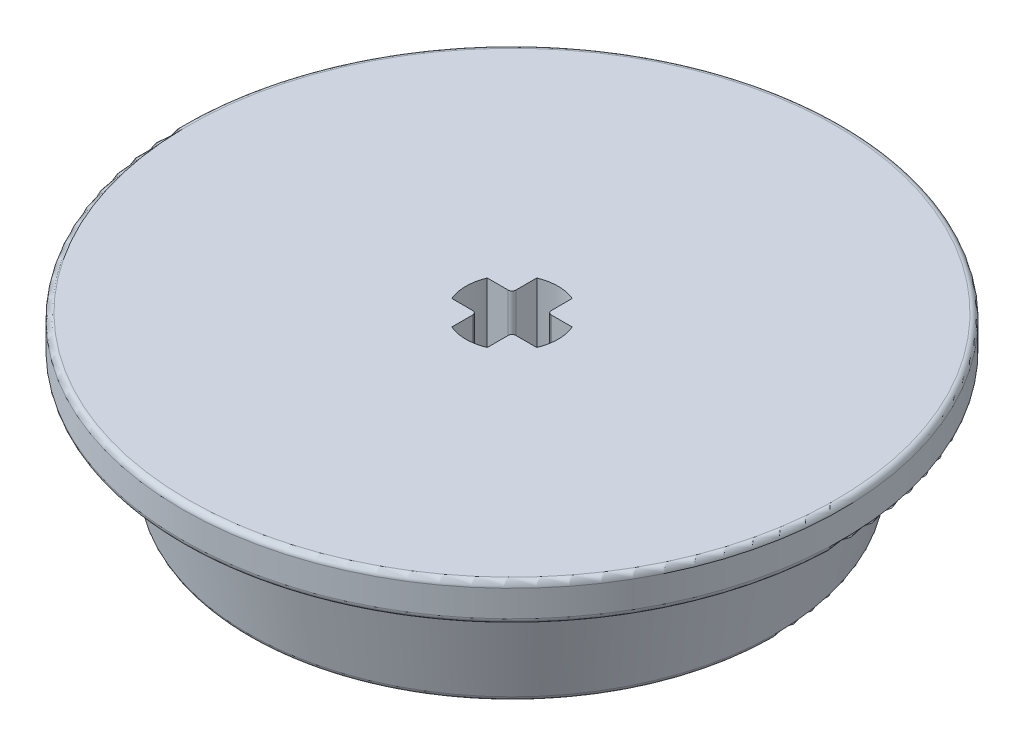
ISO-10303-21;
HEADER;
FILE_DESCRIPTION(('STEP AP214'),'2;1');
FILE_NAME('part.step','',(''),(''),'','','');
FILE_SCHEMA(('AUTOMOTIVE_DESIGN { 1 0 10303 214 1 1 1 1 }'));
ENDSEC;
DATA;
#1=APPLICATION_CONTEXT('core data for automotive mechanical design processes');
#2=APPLICATION_PROTOCOL_DEFINITION('international standard','automotive_design',2000,#1);
#3=PRODUCT_CONTEXT('',#1,'mechanical');
#4=PRODUCT('Part','Part','',(#3));
#5=PRODUCT_RELATED_PRODUCT_CATEGORY('part','',(#4));
#6=PRODUCT_DEFINITION_FORMATION('','',#4);
#7=PRODUCT_DEFINITION_CONTEXT('part definition',#1,'design');
#8=PRODUCT_DEFINITION('design','',#6,#7);
#9=PRODUCT_DEFINITION_SHAPE('','',#8);
#10=(LENGTH_UNIT() NAMED_UNIT(*) SI_UNIT(.MILLI.,.METRE.));
#11=(NAMED_UNIT(*) PLANE_ANGLE_UNIT() SI_UNIT($,.RADIAN.));
#12=(NAMED_UNIT(*) SI_UNIT($,.STERADIAN.) SOLID_ANGLE_UNIT());
#13=UNCERTAINTY_MEASURE_WITH_UNIT(LENGTH_MEASURE(1.E-05),#10,'distance_accuracy_value','');
#14=(GEOMETRIC_REPRESENTATION_CONTEXT(3) GLOBAL_UNCERTAINTY_ASSIGNED_CONTEXT((#13)) GLOBAL_UNIT_ASSIGNED_CONTEXT((#10,
#11,#12)) REPRESENTATION_CONTEXT('',''));
#15=CARTESIAN_POINT('',(0.,0.,0.));
#16=DIRECTION('',(0.,0.,1.));
#17=DIRECTION('',(1.,0.,0.));
#18=AXIS2_PLACEMENT_3D('',#15,#16,#17);
#19=CARTESIAN_POINT('',(0.,0.,0.));
#20=DIRECTION('',(0.,1.,0.));
#21=DIRECTION('',(0.,0.,1.));
#22=AXIS2_PLACEMENT_3D('',#19,#20,#21);
#23=PLANE('',#22);
#24=CARTESIAN_POINT('',(0.,0.,0.));
#25=DIRECTION('',(0.,1.,0.));
#26=DIRECTION('',(0.,0.,1.));
#27=AXIS2_PLACEMENT_3D('',#24,#25,#26);
#28=CIRCLE('',#27,17.1604709958205);
#29=CARTESIAN_POINT('',(0.,0.,17.1604709958205));
#30=VERTEX_POINT('',#29);
#31=EDGE_CURVE('E292',#30,#30,#28,.T.);
#32=ORIENTED_EDGE('',*,*,#31,.T.);
#33=EDGE_LOOP('',(#32));
#34=FACE_BOUND('',#33,.T.);
#35=DIRECTION('',(0.,0.,1.));
#36=VECTOR('',#35,1.);
#37=CARTESIAN_POINT('',(-0.940000000000001,0.,0.940000000000009));
#38=LINE('',#37,#36);
#39=CARTESIAN_POINT('',(-0.940000000000001,0.,1.14000000000001));
#40=VERTEX_POINT('',#39);
#41=CARTESIAN_POINT('',(-0.94,0.,2.25166604983954));
#42=VERTEX_POINT('',#41);
#43=EDGE_CURVE('E209',#40,#42,#38,.T.);
#44=ORIENTED_EDGE('',*,*,#43,.F.);
#45=CARTESIAN_POINT('',(-1.14,0.,1.14000000000001));
#46=DIRECTION('',(0.,1.,0.));
#47=DIRECTION('',(0.,0.,1.));
#48=AXIS2_PLACEMENT_3D('',#45,#46,#47);
#49=CIRCLE('',#48,0.2);
#50=CARTESIAN_POINT('',(-1.14,0.,0.940000000000009));
#51=VERTEX_POINT('',#50);
#52=EDGE_CURVE('E253',#40,#51,#49,.T.);
#53=ORIENTED_EDGE('',*,*,#52,.T.);
#54=DIRECTION('',(1.,0.,0.));
#55=VECTOR('',#54,1.);
#56=CARTESIAN_POINT('',(-2.25166604983954,0.,0.940000000000009));
#57=LINE('',#56,#55);
#58=CARTESIAN_POINT('',(-2.25166604983954,0.,0.940000000000008));
#59=VERTEX_POINT('',#58);
#60=EDGE_CURVE('E207',#59,#51,#57,.T.);
#61=ORIENTED_EDGE('',*,*,#60,.F.);
#62=CARTESIAN_POINT('',(0.,0.,0.));
#63=DIRECTION('',(0.,1.,0.));
#64=DIRECTION('',(0.,0.,1.));
#65=AXIS2_PLACEMENT_3D('',#62,#63,#64);
#66=CIRCLE('',#65,2.44);
#67=CARTESIAN_POINT('',(-2.25166604983954,0.,-0.940000000000009));
#68=VERTEX_POINT('',#67);
#69=EDGE_CURVE('E159',#68,#59,#66,.T.);
#70=ORIENTED_EDGE('',*,*,#69,.F.);
#71=DIRECTION('',(-1.,0.,0.));
#72=VECTOR('',#71,1.);
#73=CARTESIAN_POINT('',(-0.94,0.,-0.940000000000009));
#74=LINE('',#73,#72);
#75=CARTESIAN_POINT('',(-1.14,0.,-0.940000000000009));
#76=VERTEX_POINT('',#75);
#77=EDGE_CURVE('E204',#76,#68,#74,.T.);
#78=ORIENTED_EDGE('',*,*,#77,.F.);
#79=CARTESIAN_POINT('',(-1.14,0.,-1.14000000000001));
#80=DIRECTION('',(0.,1.,0.));
#81=DIRECTION('',(0.,0.,1.));
#82=AXIS2_PLACEMENT_3D('',#79,#80,#81);
#83=CIRCLE('',#82,0.2);
#84=CARTESIAN_POINT('',(-0.94,0.,-1.14000000000001));
#85=VERTEX_POINT('',#84);
#86=EDGE_CURVE('E247',#76,#85,#83,.T.);
#87=ORIENTED_EDGE('',*,*,#86,.T.);
#88=DIRECTION('',(0.,0.,1.));
#89=VECTOR('',#88,1.);
#90=CARTESIAN_POINT('',(-0.94,0.,-2.25166604983954));
#91=LINE('',#90,#89);
#92=CARTESIAN_POINT('',(-0.940000000000001,0.,-2.25166604983954));
#93=VERTEX_POINT('',#92);
#94=EDGE_CURVE('E201',#93,#85,#91,.T.);
#95=ORIENTED_EDGE('',*,*,#94,.F.);
#96=CARTESIAN_POINT('',(0.,0.,0.));
#97=DIRECTION('',(0.,1.,0.));
#98=DIRECTION('',(0.,0.,-1.));
#99=AXIS2_PLACEMENT_3D('',#96,#97,#98);
#100=CIRCLE('',#99,2.44);
#101=CARTESIAN_POINT('',(0.94,0.,-2.25166604983954));
#102=VERTEX_POINT('',#101);
#103=EDGE_CURVE('E226',#102,#93,#100,.T.);
#104=ORIENTED_EDGE('',*,*,#103,.F.);
#105=DIRECTION('',(0.,0.,-1.));
#106=VECTOR('',#105,1.);
#107=CARTESIAN_POINT('',(0.94,0.,-2.25166604983954));
#108=LINE('',#107,#106);
#109=CARTESIAN_POINT('',(0.94,0.,-1.14));
#110=VERTEX_POINT('',#109);
#111=EDGE_CURVE('E224',#110,#102,#108,.T.);
#112=ORIENTED_EDGE('',*,*,#111,.F.);
#113=CARTESIAN_POINT('',(1.14,0.,-1.14));
#114=DIRECTION('',(0.,1.,0.));
#115=DIRECTION('',(0.,0.,1.));
#116=AXIS2_PLACEMENT_3D('',#113,#114,#115);
#117=CIRCLE('',#116,0.2);
#118=CARTESIAN_POINT('',(1.14,0.,-0.940000000000003));
#119=VERTEX_POINT('',#118);
#120=EDGE_CURVE('E249',#110,#119,#117,.T.);
#121=ORIENTED_EDGE('',*,*,#120,.T.);
#122=DIRECTION('',(-1.,0.,0.));
#123=VECTOR('',#122,1.);
#124=CARTESIAN_POINT('',(0.94,0.,-0.940000000000003));
#125=LINE('',#124,#123);
#126=CARTESIAN_POINT('',(2.25166604983954,0.,-0.940000000000003));
#127=VERTEX_POINT('',#126);
#128=EDGE_CURVE('E222',#127,#119,#125,.T.);
#129=ORIENTED_EDGE('',*,*,#128,.F.);
#130=CARTESIAN_POINT('',(0.,0.,0.));
#131=DIRECTION('',(0.,1.,0.));
#132=DIRECTION('',(0.,0.,-1.));
#133=AXIS2_PLACEMENT_3D('',#130,#131,#132);
#134=CIRCLE('',#133,2.44);
#135=CARTESIAN_POINT('',(2.25166604983954,0.,0.940000000000003));
#136=VERTEX_POINT('',#135);
#137=EDGE_CURVE('E219',#136,#127,#134,.T.);
#138=ORIENTED_EDGE('',*,*,#137,.F.);
#139=DIRECTION('',(1.,0.,0.));
#140=VECTOR('',#139,1.);
#141=CARTESIAN_POINT('',(0.940000000000001,0.,0.940000000000003));
#142=LINE('',#141,#140);
#143=CARTESIAN_POINT('',(1.14,0.,0.940000000000003));
#144=VERTEX_POINT('',#143);
#145=EDGE_CURVE('E217',#144,#136,#142,.T.);
#146=ORIENTED_EDGE('',*,*,#145,.F.);
#147=CARTESIAN_POINT('',(1.14,0.,1.14));
#148=DIRECTION('',(0.,1.,0.));
#149=DIRECTION('',(0.,0.,1.));
#150=AXIS2_PLACEMENT_3D('',#147,#148,#149);
#151=CIRCLE('',#150,0.2);
#152=CARTESIAN_POINT('',(0.940000000000001,0.,1.14));
#153=VERTEX_POINT('',#152);
#154=EDGE_CURVE('E251',#144,#153,#151,.T.);
#155=ORIENTED_EDGE('',*,*,#154,.T.);
#156=DIRECTION('',(0.,0.,-1.));
#157=VECTOR('',#156,1.);
#158=CARTESIAN_POINT('',(0.940000000000001,0.,2.25166604983954));
#159=LINE('',#158,#157);
#160=CARTESIAN_POINT('',(0.94,0.,2.25166604983954));
#161=VERTEX_POINT('',#160);
#162=EDGE_CURVE('E214',#161,#153,#159,.T.);
#163=ORIENTED_EDGE('',*,*,#162,.F.);
#164=CARTESIAN_POINT('',(0.,0.,0.));
#165=DIRECTION('',(0.,1.,0.));
#166=DIRECTION('',(0.,0.,1.));
#167=AXIS2_PLACEMENT_3D('',#164,#165,#166);
#168=CIRCLE('',#167,2.44);
#169=EDGE_CURVE('E211',#42,#161,#168,.T.);
#170=ORIENTED_EDGE('',*,*,#169,.F.);
#171=EDGE_LOOP('',(#44,#53,#61,#70,#78,#87,#95,#104,#112,#121,#129,#138,#146,#155,#163,#170));
#172=FACE_BOUND('',#171,.T.);
#173=ADVANCED_FACE('F36',(#34,#172),#23,.T.);
#174=CARTESIAN_POINT('',(0.,0.,0.));
#175=DIRECTION('',(0.,-1.,0.));
#176=DIRECTION('',(0.,0.,-1.));
#177=AXIS2_PLACEMENT_3D('',#174,#175,#176);
#178=CYLINDRICAL_SURFACE('',#177,17.4604709958205);
#179=CARTESIAN_POINT('',(0.,-0.3,0.));
#180=DIRECTION('',(0.,1.,0.));
#181=DIRECTION('',(0.,0.,1.));
#182=AXIS2_PLACEMENT_3D('',#179,#180,#181);
#183=CIRCLE('',#182,17.4604709958205);
#184=CARTESIAN_POINT('',(0.,-0.3,17.4604709958205));
#185=VERTEX_POINT('',#184);
#186=EDGE_CURVE('E289',#185,#185,#183,.F.);
#187=ORIENTED_EDGE('',*,*,#186,.T.);
#188=EDGE_LOOP('',(#187));
#189=FACE_BOUND('',#188,.T.);
#190=CARTESIAN_POINT('',(0.,-1.7,0.));
#191=DIRECTION('',(0.,-1.,0.));
#192=DIRECTION('',(0.,0.,-1.));
#193=AXIS2_PLACEMENT_3D('',#190,#191,#192);
#194=CIRCLE('',#193,17.4604709958205);
#195=CARTESIAN_POINT('',(0.,-1.7,-17.4604709958205));
#196=VERTEX_POINT('',#195);
#197=EDGE_CURVE('E286',#196,#196,#194,.F.);
#198=ORIENTED_EDGE('',*,*,#197,.T.);
#199=EDGE_LOOP('',(#198));
#200=FACE_BOUND('',#199,.T.);
#201=ADVANCED_FACE('F309',(#189,#200),#178,.T.);
#202=CARTESIAN_POINT('',(17.4604709958205,-2.,0.));
#203=DIRECTION('',(0.,-1.,0.));
#204=DIRECTION('',(0.,0.,-1.));
#205=AXIS2_PLACEMENT_3D('',#202,#203,#204);
#206=PLANE('',#205);
#207=CARTESIAN_POINT('',(0.,-2.,0.));
#208=DIRECTION('',(0.,-1.,0.));
#209=DIRECTION('',(0.,0.,-1.));
#210=AXIS2_PLACEMENT_3D('',#207,#208,#209);
#211=CIRCLE('',#210,15.2506361989496);
#212=CARTESIAN_POINT('',(0.,-2.,-15.2506361989496));
#213=VERTEX_POINT('',#212);
#214=EDGE_CURVE('E11',#213,#213,#211,.F.);
#215=ORIENTED_EDGE('',*,*,#214,.T.);
#216=EDGE_LOOP('',(#215));
#217=FACE_BOUND('',#216,.T.);
#218=CARTESIAN_POINT('',(0.,-2.,0.));
#219=DIRECTION('',(0.,-1.,0.));
#220=DIRECTION('',(0.,0.,-1.));
#221=AXIS2_PLACEMENT_3D('',#218,#219,#220);
#222=CIRCLE('',#221,17.1604709958205);
#223=CARTESIAN_POINT('',(0.,-2.,-17.1604709958205));
#224=VERTEX_POINT('',#223);
#225=EDGE_CURVE('E44',#224,#224,#222,.T.);
#226=ORIENTED_EDGE('',*,*,#225,.T.);
#227=EDGE_LOOP('',(#226));
#228=FACE_BOUND('',#227,.T.);
#229=ADVANCED_FACE('F297',(#217,#228),#206,.T.);
#230=CARTESIAN_POINT('',(0.,-8.,0.));
#231=DIRECTION('',(0.,1.,0.));
#232=DIRECTION('',(0.,0.,1.));
#233=AXIS2_PLACEMENT_3D('',#230,#231,#232);
#234=CONICAL_SURFACE('',#233,13.9155,0.178819305732636);
#235=CARTESIAN_POINT('',(0.,-7.75336034909016,0.));
#236=DIRECTION('',(0.,-1.,0.));
#237=DIRECTION('',(0.,0.,-1.));
#238=AXIS2_PLACEMENT_3D('',#235,#236,#237);
#239=CIRCLE('',#238,13.960080116902);
#240=CARTESIAN_POINT('',(0.,-7.75336034909016,-13.960080116902));
#241=VERTEX_POINT('',#240);
#242=EDGE_CURVE('E283',#241,#241,#239,.F.);
#243=ORIENTED_EDGE('',*,*,#242,.T.);
#244=EDGE_LOOP('',(#243));
#245=FACE_BOUND('',#244,.T.);
#246=CARTESIAN_POINT('',(0.,-2.24663965090983,0.));
#247=DIRECTION('',(0.,1.,0.));
#248=DIRECTION('',(0.,0.,1.));
#249=AXIS2_PLACEMENT_3D('',#246,#247,#248);
#250=CIRCLE('',#249,14.955419883098);
#251=CARTESIAN_POINT('',(0.,-2.24663965090983,14.955419883098));
#252=VERTEX_POINT('',#251);
#253=EDGE_CURVE('E280',#252,#252,#250,.F.);
#254=ORIENTED_EDGE('',*,*,#253,.T.);
#255=EDGE_LOOP('',(#254));
#256=FACE_BOUND('',#255,.T.);
#257=ADVANCED_FACE('F519',(#245,#256),#234,.T.);
#258=CARTESIAN_POINT('',(13.9155,-8.,0.));
#259=DIRECTION('',(0.,-1.,0.));
#260=DIRECTION('',(0.,0.,-1.));
#261=AXIS2_PLACEMENT_3D('',#258,#259,#260);
#262=PLANE('',#261);
#263=CARTESIAN_POINT('',(0.,-8.,0.));
#264=DIRECTION('',(0.,-1.,0.));
#265=DIRECTION('',(0.,0.,-1.));
#266=AXIS2_PLACEMENT_3D('',#263,#264,#265);
#267=CIRCLE('',#266,13.6648638010504);
#268=CARTESIAN_POINT('',(0.,-8.,-13.6648638010504));
#269=VERTEX_POINT('',#268);
#270=EDGE_CURVE('E277',#269,#269,#267,.T.);
#271=ORIENTED_EDGE('',*,*,#270,.T.);
#272=EDGE_LOOP('',(#271));
#273=FACE_BOUND('',#272,.T.);
#274=DIRECTION('',(1.,0.,0.));
#275=VECTOR('',#274,1.);
#276=CARTESIAN_POINT('',(-2.25166604983954,-8.,0.940000000000009));
#277=LINE('',#276,#275);
#278=CARTESIAN_POINT('',(-2.25166604983954,-8.,0.940000000000008));
#279=VERTEX_POINT('',#278);
#280=CARTESIAN_POINT('',(-1.14,-8.,0.940000000000009));
#281=VERTEX_POINT('',#280);
#282=EDGE_CURVE('E167',#279,#281,#277,.T.);
#283=ORIENTED_EDGE('',*,*,#282,.T.);
#284=CARTESIAN_POINT('',(-1.14,-8.,1.14000000000001));
#285=DIRECTION('',(0.,-1.,0.));
#286=DIRECTION('',(0.,0.,-1.));
#287=AXIS2_PLACEMENT_3D('',#284,#285,#286);
#288=CIRCLE('',#287,0.2);
#289=CARTESIAN_POINT('',(-0.940000000000001,-8.,1.14000000000001));
#290=VERTEX_POINT('',#289);
#291=EDGE_CURVE('E261',#281,#290,#288,.T.);
#292=ORIENTED_EDGE('',*,*,#291,.T.);
#293=DIRECTION('',(0.,0.,1.));
#294=VECTOR('',#293,1.);
#295=CARTESIAN_POINT('',(-0.940000000000001,-8.,0.940000000000009));
#296=LINE('',#295,#294);
#297=CARTESIAN_POINT('',(-0.94,-8.,2.25166604983954));
#298=VERTEX_POINT('',#297);
#299=EDGE_CURVE('E172',#290,#298,#296,.T.);
#300=ORIENTED_EDGE('',*,*,#299,.T.);
#301=CARTESIAN_POINT('',(0.,-8.,0.));
#302=DIRECTION('',(0.,1.,0.));
#303=DIRECTION('',(0.,0.,1.));
#304=AXIS2_PLACEMENT_3D('',#301,#302,#303);
#305=CIRCLE('',#304,2.44);
#306=CARTESIAN_POINT('',(0.94,-8.,2.25166604983954));
#307=VERTEX_POINT('',#306);
#308=EDGE_CURVE('E183',#298,#307,#305,.T.);
#309=ORIENTED_EDGE('',*,*,#308,.T.);
#310=DIRECTION('',(0.,0.,-1.));
#311=VECTOR('',#310,1.);
#312=CARTESIAN_POINT('',(0.940000000000001,-8.,2.25166604983954));
#313=LINE('',#312,#311);
#314=CARTESIAN_POINT('',(0.940000000000001,-8.,1.14));
#315=VERTEX_POINT('',#314);
#316=EDGE_CURVE('E186',#307,#315,#313,.T.);
#317=ORIENTED_EDGE('',*,*,#316,.T.);
#318=CARTESIAN_POINT('',(1.14,-8.,1.14));
#319=DIRECTION('',(0.,-1.,0.));
#320=DIRECTION('',(0.,0.,-1.));
#321=AXIS2_PLACEMENT_3D('',#318,#319,#320);
#322=CIRCLE('',#321,0.2);
#323=CARTESIAN_POINT('',(1.14,-8.,0.940000000000003));
#324=VERTEX_POINT('',#323);
#325=EDGE_CURVE('E259',#315,#324,#322,.T.);
#326=ORIENTED_EDGE('',*,*,#325,.T.);
#327=DIRECTION('',(1.,0.,0.));
#328=VECTOR('',#327,1.);
#329=CARTESIAN_POINT('',(0.940000000000001,-8.,0.940000000000003));
#330=LINE('',#329,#328);
#331=CARTESIAN_POINT('',(2.25166604983954,-8.,0.940000000000003));
#332=VERTEX_POINT('',#331);
#333=EDGE_CURVE('E189',#324,#332,#330,.T.);
#334=ORIENTED_EDGE('',*,*,#333,.T.);
#335=CARTESIAN_POINT('',(0.,-8.,0.));
#336=DIRECTION('',(0.,1.,0.));
#337=DIRECTION('',(0.,0.,-1.));
#338=AXIS2_PLACEMENT_3D('',#335,#336,#337);
#339=CIRCLE('',#338,2.44);
#340=CARTESIAN_POINT('',(2.25166604983954,-8.,-0.940000000000003));
#341=VERTEX_POINT('',#340);
#342=EDGE_CURVE('E191',#332,#341,#339,.T.);
#343=ORIENTED_EDGE('',*,*,#342,.T.);
#344=DIRECTION('',(-1.,0.,0.));
#345=VECTOR('',#344,1.);
#346=CARTESIAN_POINT('',(0.94,-8.,-0.940000000000003));
#347=LINE('',#346,#345);
#348=CARTESIAN_POINT('',(1.14,-8.,-0.940000000000003));
#349=VERTEX_POINT('',#348);
#350=EDGE_CURVE('E194',#341,#349,#347,.T.);
#351=ORIENTED_EDGE('',*,*,#350,.T.);
#352=CARTESIAN_POINT('',(1.14,-8.,-1.14));
#353=DIRECTION('',(0.,-1.,0.));
#354=DIRECTION('',(0.,0.,-1.));
#355=AXIS2_PLACEMENT_3D('',#352,#353,#354);
#356=CIRCLE('',#355,0.2);
#357=CARTESIAN_POINT('',(0.94,-8.,-1.14));
#358=VERTEX_POINT('',#357);
#359=EDGE_CURVE('E51',#349,#358,#356,.T.);
#360=ORIENTED_EDGE('',*,*,#359,.T.);
#361=DIRECTION('',(0.,0.,-1.));
#362=VECTOR('',#361,1.);
#363=CARTESIAN_POINT('',(0.94,-8.,-2.25166604983954));
#364=LINE('',#363,#362);
#365=CARTESIAN_POINT('',(0.94,-8.,-2.25166604983954));
#366=VERTEX_POINT('',#365);
#367=EDGE_CURVE('E196',#358,#366,#364,.T.);
#368=ORIENTED_EDGE('',*,*,#367,.T.);
#369=CARTESIAN_POINT('',(0.,-8.,0.));
#370=DIRECTION('',(0.,1.,0.));
#371=DIRECTION('',(0.,0.,-1.));
#372=AXIS2_PLACEMENT_3D('',#369,#370,#371);
#373=CIRCLE('',#372,2.44);
#374=CARTESIAN_POINT('',(-0.940000000000001,-8.,-2.25166604983954));
#375=VERTEX_POINT('',#374);
#376=EDGE_CURVE('E198',#366,#375,#373,.T.);
#377=ORIENTED_EDGE('',*,*,#376,.T.);
#378=DIRECTION('',(0.,0.,1.));
#379=VECTOR('',#378,1.);
#380=CARTESIAN_POINT('',(-0.94,-8.,-2.25166604983954));
#381=LINE('',#380,#379);
#382=CARTESIAN_POINT('',(-0.94,-8.,-1.14000000000001));
#383=VERTEX_POINT('',#382);
#384=EDGE_CURVE('E178',#375,#383,#381,.T.);
#385=ORIENTED_EDGE('',*,*,#384,.T.);
#386=CARTESIAN_POINT('',(-1.14,-8.,-1.14000000000001));
#387=DIRECTION('',(0.,-1.,0.));
#388=DIRECTION('',(0.,0.,-1.));
#389=AXIS2_PLACEMENT_3D('',#386,#387,#388);
#390=CIRCLE('',#389,0.2);
#391=CARTESIAN_POINT('',(-1.14,-8.,-0.940000000000009));
#392=VERTEX_POINT('',#391);
#393=EDGE_CURVE('E256',#383,#392,#390,.T.);
#394=ORIENTED_EDGE('',*,*,#393,.T.);
#395=DIRECTION('',(-1.,0.,0.));
#396=VECTOR('',#395,1.);
#397=CARTESIAN_POINT('',(-0.94,-8.,-0.940000000000009));
#398=LINE('',#397,#396);
#399=CARTESIAN_POINT('',(-2.25166604983954,-8.,-0.940000000000009));
#400=VERTEX_POINT('',#399);
#401=EDGE_CURVE('E176',#392,#400,#398,.T.);
#402=ORIENTED_EDGE('',*,*,#401,.T.);
#403=CARTESIAN_POINT('',(0.,-8.,0.));
#404=DIRECTION('',(0.,1.,0.));
#405=DIRECTION('',(0.,0.,1.));
#406=AXIS2_PLACEMENT_3D('',#403,#404,#405);
#407=CIRCLE('',#406,2.44);
#408=EDGE_CURVE('E156',#400,#279,#407,.T.);
#409=ORIENTED_EDGE('',*,*,#408,.T.);
#410=EDGE_LOOP('',(#283,#292,#300,#309,#317,#326,#334,#343,#351,#360,#368,#377,#385,#394,#402,#409));
#411=FACE_BOUND('',#410,.T.);
#412=ADVANCED_FACE('F174',(#273,#411),#262,.T.);
#413=CARTESIAN_POINT('',(-0.94,-8.,-2.25166604983954));
#414=DIRECTION('',(-1.,0.,0.));
#415=DIRECTION('',(0.,0.,1.));
#416=AXIS2_PLACEMENT_3D('',#413,#414,#415);
#417=PLANE('',#416);
#418=ORIENTED_EDGE('',*,*,#94,.T.);
#419=DIRECTION('',(0.,1.,0.));
#420=VECTOR('',#419,1.);
#421=CARTESIAN_POINT('',(-0.94,-8.,-1.14000000000001));
#422=LINE('',#421,#420);
#423=EDGE_CURVE('E275',#85,#383,#422,.F.);
#424=ORIENTED_EDGE('',*,*,#423,.T.);
#425=ORIENTED_EDGE('',*,*,#384,.F.);
#426=DIRECTION('',(0.,1.,0.));
#427=VECTOR('',#426,1.);
#428=CARTESIAN_POINT('',(-0.940000000000001,-8.,-2.25166604983954));
#429=LINE('',#428,#427);
#430=EDGE_CURVE('E229',#375,#93,#429,.T.);
#431=ORIENTED_EDGE('',*,*,#430,.T.);
#432=EDGE_LOOP('',(#418,#424,#425,#431));
#433=FACE_BOUND('',#432,.T.);
#434=ADVANCED_FACE('F500',(#433),#417,.F.);
#435=CARTESIAN_POINT('',(0.,-8.,0.));
#436=DIRECTION('',(0.,1.,0.));
#437=DIRECTION('',(0.,0.,1.));
#438=AXIS2_PLACEMENT_3D('',#435,#436,#437);
#439=CYLINDRICAL_SURFACE('',#438,2.44);
#440=ORIENTED_EDGE('',*,*,#103,.T.);
#441=ORIENTED_EDGE('',*,*,#430,.F.);
#442=ORIENTED_EDGE('',*,*,#376,.F.);
#443=DIRECTION('',(0.,1.,0.));
#444=VECTOR('',#443,1.);
#445=CARTESIAN_POINT('',(0.94,-8.,-2.25166604983954));
#446=LINE('',#445,#444);
#447=EDGE_CURVE('E232',#366,#102,#446,.T.);
#448=ORIENTED_EDGE('',*,*,#447,.T.);
#449=EDGE_LOOP('',(#440,#441,#442,#448));
#450=FACE_BOUND('',#449,.T.);
#451=ADVANCED_FACE('F490',(#450),#439,.F.);
#452=CARTESIAN_POINT('',(0.94,-8.,-2.25166604983954));
#453=DIRECTION('',(1.,0.,0.));
#454=DIRECTION('',(0.,0.,-1.));
#455=AXIS2_PLACEMENT_3D('',#452,#453,#454);
#456=PLANE('',#455);
#457=ORIENTED_EDGE('',*,*,#367,.F.);
#458=DIRECTION('',(0.,1.,0.));
#459=VECTOR('',#458,1.);
#460=CARTESIAN_POINT('',(0.94,-8.,-1.14));
#461=LINE('',#460,#459);
#462=EDGE_CURVE('E268',#358,#110,#461,.T.);
#463=ORIENTED_EDGE('',*,*,#462,.T.);
#464=ORIENTED_EDGE('',*,*,#111,.T.);
#465=ORIENTED_EDGE('',*,*,#447,.F.);
#466=EDGE_LOOP('',(#457,#463,#464,#465));
#467=FACE_BOUND('',#466,.T.);
#468=ADVANCED_FACE('F481',(#467),#456,.F.);
#469=CARTESIAN_POINT('',(0.94,-8.,-0.940000000000003));
#470=DIRECTION('',(0.,0.,-1.));
#471=DIRECTION('',(-1.,0.,0.));
#472=AXIS2_PLACEMENT_3D('',#469,#470,#471);
#473=PLANE('',#472);
#474=ORIENTED_EDGE('',*,*,#128,.T.);
#475=DIRECTION('',(0.,1.,0.));
#476=VECTOR('',#475,1.);
#477=CARTESIAN_POINT('',(1.14,-8.,-0.940000000000003));
#478=LINE('',#477,#476);
#479=EDGE_CURVE('E59',#119,#349,#478,.F.);
#480=ORIENTED_EDGE('',*,*,#479,.T.);
#481=ORIENTED_EDGE('',*,*,#350,.F.);
#482=DIRECTION('',(0.,1.,0.));
#483=VECTOR('',#482,1.);
#484=CARTESIAN_POINT('',(2.25166604983954,-8.,-0.940000000000003));
#485=LINE('',#484,#483);
#486=EDGE_CURVE('E235',#341,#127,#485,.T.);
#487=ORIENTED_EDGE('',*,*,#486,.T.);
#488=EDGE_LOOP('',(#474,#480,#481,#487));
#489=FACE_BOUND('',#488,.T.);
#490=ADVANCED_FACE('F471',(#489),#473,.F.);
#491=CARTESIAN_POINT('',(0.,-8.,0.));
#492=DIRECTION('',(0.,1.,0.));
#493=DIRECTION('',(0.,0.,1.));
#494=AXIS2_PLACEMENT_3D('',#491,#492,#493);
#495=CYLINDRICAL_SURFACE('',#494,2.44);
#496=ORIENTED_EDGE('',*,*,#137,.T.);
#497=ORIENTED_EDGE('',*,*,#486,.F.);
#498=ORIENTED_EDGE('',*,*,#342,.F.);
#499=DIRECTION('',(0.,1.,0.));
#500=VECTOR('',#499,1.);
#501=CARTESIAN_POINT('',(2.25166604983954,-8.,0.940000000000003));
#502=LINE('',#501,#500);
#503=EDGE_CURVE('E237',#332,#136,#502,.T.);
#504=ORIENTED_EDGE('',*,*,#503,.T.);
#505=EDGE_LOOP('',(#496,#497,#498,#504));
#506=FACE_BOUND('',#505,.T.);
#507=ADVANCED_FACE('F461',(#506),#495,.F.);
#508=CARTESIAN_POINT('',(0.940000000000001,-8.,0.940000000000003));
#509=DIRECTION('',(0.,0.,1.));
#510=DIRECTION('',(1.,0.,0.));
#511=AXIS2_PLACEMENT_3D('',#508,#509,#510);
#512=PLANE('',#511);
#513=ORIENTED_EDGE('',*,*,#333,.F.);
#514=DIRECTION('',(0.,1.,0.));
#515=VECTOR('',#514,1.);
#516=CARTESIAN_POINT('',(1.14,-8.,0.940000000000003));
#517=LINE('',#516,#515);
#518=EDGE_CURVE('E263',#324,#144,#517,.T.);
#519=ORIENTED_EDGE('',*,*,#518,.T.);
#520=ORIENTED_EDGE('',*,*,#145,.T.);
#521=ORIENTED_EDGE('',*,*,#503,.F.);
#522=EDGE_LOOP('',(#513,#519,#520,#521));
#523=FACE_BOUND('',#522,.T.);
#524=ADVANCED_FACE('F451',(#523),#512,.F.);
#525=CARTESIAN_POINT('',(0.940000000000001,-8.,2.25166604983954));
#526=DIRECTION('',(1.,0.,0.));
#527=DIRECTION('',(0.,0.,-1.));
#528=AXIS2_PLACEMENT_3D('',#525,#526,#527);
#529=PLANE('',#528);
#530=ORIENTED_EDGE('',*,*,#162,.T.);
#531=DIRECTION('',(0.,1.,0.));
#532=VECTOR('',#531,1.);
#533=CARTESIAN_POINT('',(0.940000000000001,-8.,1.14));
#534=LINE('',#533,#532);
#535=EDGE_CURVE('E266',#153,#315,#534,.F.);
#536=ORIENTED_EDGE('',*,*,#535,.T.);
#537=ORIENTED_EDGE('',*,*,#316,.F.);
#538=DIRECTION('',(0.,1.,0.));
#539=VECTOR('',#538,1.);
#540=CARTESIAN_POINT('',(0.94,-8.,2.25166604983954));
#541=LINE('',#540,#539);
#542=EDGE_CURVE('E240',#307,#161,#541,.T.);
#543=ORIENTED_EDGE('',*,*,#542,.T.);
#544=EDGE_LOOP('',(#530,#536,#537,#543));
#545=FACE_BOUND('',#544,.T.);
#546=ADVANCED_FACE('F441',(#545),#529,.F.);
#547=CARTESIAN_POINT('',(0.,-8.,0.));
#548=DIRECTION('',(0.,1.,0.));
#549=DIRECTION('',(0.,0.,1.));
#550=AXIS2_PLACEMENT_3D('',#547,#548,#549);
#551=CYLINDRICAL_SURFACE('',#550,2.44);
#552=ORIENTED_EDGE('',*,*,#169,.T.);
#553=ORIENTED_EDGE('',*,*,#542,.F.);
#554=ORIENTED_EDGE('',*,*,#308,.F.);
#555=DIRECTION('',(0.,1.,0.));
#556=VECTOR('',#555,1.);
#557=CARTESIAN_POINT('',(-0.94,-8.,2.25166604983954));
#558=LINE('',#557,#556);
#559=EDGE_CURVE('E163',#298,#42,#558,.T.);
#560=ORIENTED_EDGE('',*,*,#559,.T.);
#561=EDGE_LOOP('',(#552,#553,#554,#560));
#562=FACE_BOUND('',#561,.T.);
#563=ADVANCED_FACE('F431',(#562),#551,.F.);
#564=CARTESIAN_POINT('',(-0.940000000000001,-8.,0.940000000000009));
#565=DIRECTION('',(-1.,0.,0.));
#566=DIRECTION('',(0.,0.,1.));
#567=AXIS2_PLACEMENT_3D('',#564,#565,#566);
#568=PLANE('',#567);
#569=ORIENTED_EDGE('',*,*,#299,.F.);
#570=DIRECTION('',(0.,1.,0.));
#571=VECTOR('',#570,1.);
#572=CARTESIAN_POINT('',(-0.940000000000001,-8.,1.14000000000001));
#573=LINE('',#572,#571);
#574=EDGE_CURVE('E231',#290,#40,#573,.T.);
#575=ORIENTED_EDGE('',*,*,#574,.T.);
#576=ORIENTED_EDGE('',*,*,#43,.T.);
#577=ORIENTED_EDGE('',*,*,#559,.F.);
#578=EDGE_LOOP('',(#569,#575,#576,#577));
#579=FACE_BOUND('',#578,.T.);
#580=ADVANCED_FACE('F422',(#579),#568,.F.);
#581=CARTESIAN_POINT('',(-2.25166604983954,-8.,0.940000000000009));
#582=DIRECTION('',(0.,0.,1.));
#583=DIRECTION('',(1.,0.,0.));
#584=AXIS2_PLACEMENT_3D('',#581,#582,#583);
#585=PLANE('',#584);
#586=ORIENTED_EDGE('',*,*,#60,.T.);
#587=DIRECTION('',(0.,1.,0.));
#588=VECTOR('',#587,1.);
#589=CARTESIAN_POINT('',(-1.14,-8.,0.940000000000009));
#590=LINE('',#589,#588);
#591=EDGE_CURVE('E170',#51,#281,#590,.F.);
#592=ORIENTED_EDGE('',*,*,#591,.T.);
#593=ORIENTED_EDGE('',*,*,#282,.F.);
#594=DIRECTION('',(0.,1.,0.));
#595=VECTOR('',#594,1.);
#596=CARTESIAN_POINT('',(-2.25166604983954,-8.,0.940000000000008));
#597=LINE('',#596,#595);
#598=EDGE_CURVE('E151',#279,#59,#597,.T.);
#599=ORIENTED_EDGE('',*,*,#598,.T.);
#600=EDGE_LOOP('',(#586,#592,#593,#599));
#601=FACE_BOUND('',#600,.T.);
#602=ADVANCED_FACE('F168',(#601),#585,.F.);
#603=CARTESIAN_POINT('',(0.,-8.,0.));
#604=DIRECTION('',(0.,1.,0.));
#605=DIRECTION('',(0.,0.,1.));
#606=AXIS2_PLACEMENT_3D('',#603,#604,#605);
#607=CYLINDRICAL_SURFACE('',#606,2.44);
#608=ORIENTED_EDGE('',*,*,#69,.T.);
#609=ORIENTED_EDGE('',*,*,#598,.F.);
#610=ORIENTED_EDGE('',*,*,#408,.F.);
#611=DIRECTION('',(0.,1.,0.));
#612=VECTOR('',#611,1.);
#613=CARTESIAN_POINT('',(-2.25166604983954,-8.,-0.940000000000009));
#614=LINE('',#613,#612);
#615=EDGE_CURVE('E164',#400,#68,#614,.T.);
#616=ORIENTED_EDGE('',*,*,#615,.T.);
#617=EDGE_LOOP('',(#608,#609,#610,#616));
#618=FACE_BOUND('',#617,.T.);
#619=ADVANCED_FACE('F153',(#618),#607,.F.);
#620=CARTESIAN_POINT('',(-0.94,-8.,-0.940000000000009));
#621=DIRECTION('',(0.,0.,-1.));
#622=DIRECTION('',(-1.,0.,0.));
#623=AXIS2_PLACEMENT_3D('',#620,#621,#622);
#624=PLANE('',#623);
#625=ORIENTED_EDGE('',*,*,#401,.F.);
#626=DIRECTION('',(0.,1.,0.));
#627=VECTOR('',#626,1.);
#628=CARTESIAN_POINT('',(-1.14,-8.,-0.940000000000009));
#629=LINE('',#628,#627);
#630=EDGE_CURVE('E272',#392,#76,#629,.T.);
#631=ORIENTED_EDGE('',*,*,#630,.T.);
#632=ORIENTED_EDGE('',*,*,#77,.T.);
#633=ORIENTED_EDGE('',*,*,#615,.F.);
#634=EDGE_LOOP('',(#625,#631,#632,#633));
#635=FACE_BOUND('',#634,.T.);
#636=ADVANCED_FACE('F324',(#635),#624,.F.);
#637=CARTESIAN_POINT('',(-1.14,-8.,1.14000000000001));
#638=DIRECTION('',(0.,1.,0.));
#639=DIRECTION('',(0.,0.,1.));
#640=AXIS2_PLACEMENT_3D('',#637,#638,#639);
#641=CYLINDRICAL_SURFACE('',#640,0.2);
#642=ORIENTED_EDGE('',*,*,#291,.F.);
#643=ORIENTED_EDGE('',*,*,#591,.F.);
#644=ORIENTED_EDGE('',*,*,#52,.F.);
#645=ORIENTED_EDGE('',*,*,#574,.F.);
#646=EDGE_LOOP('',(#642,#643,#644,#645));
#647=FACE_BOUND('',#646,.T.);
#648=ADVANCED_FACE('F320',(#647),#641,.T.);
#649=CARTESIAN_POINT('',(1.14,-8.,1.14));
#650=DIRECTION('',(0.,1.,0.));
#651=DIRECTION('',(0.,0.,1.));
#652=AXIS2_PLACEMENT_3D('',#649,#650,#651);
#653=CYLINDRICAL_SURFACE('',#652,0.2);
#654=ORIENTED_EDGE('',*,*,#325,.F.);
#655=ORIENTED_EDGE('',*,*,#535,.F.);
#656=ORIENTED_EDGE('',*,*,#154,.F.);
#657=ORIENTED_EDGE('',*,*,#518,.F.);
#658=EDGE_LOOP('',(#654,#655,#656,#657));
#659=FACE_BOUND('',#658,.T.);
#660=ADVANCED_FACE('F323',(#659),#653,.T.);
#661=CARTESIAN_POINT('',(1.14,-8.,-1.14));
#662=DIRECTION('',(0.,1.,0.));
#663=DIRECTION('',(0.,0.,1.));
#664=AXIS2_PLACEMENT_3D('',#661,#662,#663);
#665=CYLINDRICAL_SURFACE('',#664,0.2);
#666=ORIENTED_EDGE('',*,*,#359,.F.);
#667=ORIENTED_EDGE('',*,*,#479,.F.);
#668=ORIENTED_EDGE('',*,*,#120,.F.);
#669=ORIENTED_EDGE('',*,*,#462,.F.);
#670=EDGE_LOOP('',(#666,#667,#668,#669));
#671=FACE_BOUND('',#670,.T.);
#672=ADVANCED_FACE('F328',(#671),#665,.T.);
#673=CARTESIAN_POINT('',(-1.14,-8.,-1.14000000000001));
#674=DIRECTION('',(0.,1.,0.));
#675=DIRECTION('',(0.,0.,1.));
#676=AXIS2_PLACEMENT_3D('',#673,#674,#675);
#677=CYLINDRICAL_SURFACE('',#676,0.2);
#678=ORIENTED_EDGE('',*,*,#393,.F.);
#679=ORIENTED_EDGE('',*,*,#423,.F.);
#680=ORIENTED_EDGE('',*,*,#86,.F.);
#681=ORIENTED_EDGE('',*,*,#630,.F.);
#682=EDGE_LOOP('',(#678,#679,#680,#681));
#683=FACE_BOUND('',#682,.T.);
#684=ADVANCED_FACE('F332',(#683),#677,.T.);
#685=CARTESIAN_POINT('',(0.,-7.7,0.));
#686=DIRECTION('',(0.,-1.,0.));
#687=DIRECTION('',(0.,0.,-1.));
#688=AXIS2_PLACEMENT_3D('',#685,#686,#687);
#689=TOROIDAL_SURFACE('',#688,13.6648638010504,0.3);
#690=ORIENTED_EDGE('',*,*,#242,.F.);
#691=EDGE_LOOP('',(#690));
#692=FACE_BOUND('',#691,.T.);
#693=ORIENTED_EDGE('',*,*,#270,.F.);
#694=EDGE_LOOP('',(#693));
#695=FACE_BOUND('',#694,.T.);
#696=ADVANCED_FACE('F336',(#692,#695),#689,.T.);
#697=CARTESIAN_POINT('',(0.,-0.3,0.));
#698=DIRECTION('',(0.,1.,0.));
#699=DIRECTION('',(0.,0.,1.));
#700=AXIS2_PLACEMENT_3D('',#697,#698,#699);
#701=TOROIDAL_SURFACE('',#700,17.1604709958205,0.3);
#702=ORIENTED_EDGE('',*,*,#31,.F.);
#703=EDGE_LOOP('',(#702));
#704=FACE_BOUND('',#703,.T.);
#705=ORIENTED_EDGE('',*,*,#186,.F.);
#706=EDGE_LOOP('',(#705));
#707=FACE_BOUND('',#706,.T.);
#708=ADVANCED_FACE('F305',(#704,#707),#701,.T.);
#709=CARTESIAN_POINT('',(0.,-2.3,0.));
#710=DIRECTION('',(0.,-1.,0.));
#711=DIRECTION('',(0.,0.,-1.));
#712=AXIS2_PLACEMENT_3D('',#709,#710,#711);
#713=TOROIDAL_SURFACE('',#712,15.2506361989496,0.3);
#714=ORIENTED_EDGE('',*,*,#214,.F.);
#715=EDGE_LOOP('',(#714));
#716=FACE_BOUND('',#715,.T.);
#717=ORIENTED_EDGE('',*,*,#253,.F.);
#718=EDGE_LOOP('',(#717));
#719=FACE_BOUND('',#718,.T.);
#720=ADVANCED_FACE('F300',(#716,#719),#713,.F.);
#721=CARTESIAN_POINT('',(0.,-1.7,0.));
#722=DIRECTION('',(0.,-1.,0.));
#723=DIRECTION('',(0.,0.,-1.));
#724=AXIS2_PLACEMENT_3D('',#721,#722,#723);
#725=TOROIDAL_SURFACE('',#724,17.1604709958205,0.3);
#726=ORIENTED_EDGE('',*,*,#197,.F.);
#727=EDGE_LOOP('',(#726));
#728=FACE_BOUND('',#727,.T.);
#729=ORIENTED_EDGE('',*,*,#225,.F.);
#730=EDGE_LOOP('',(#729));
#731=FACE_BOUND('',#730,.T.);
#732=ADVANCED_FACE('F38',(#728,#731),#725,.T.);
#733=CLOSED_SHELL('',(#173,#201,#229,#257,#412,#434,#451,#468,#490,#507,#524,#546,#563,#580,
#602,#619,#636,#648,#660,#672,#684,#696,#708,#720,#732));
#734=MANIFOLD_SOLID_BREP('B2',#733);
#735=ADVANCED_BREP_SHAPE_REPRESENTATION('',(#18,#734),#14);
#736=SHAPE_DEFINITION_REPRESENTATION(#9,#735);
ENDSEC;
END-ISO-10303-21;
